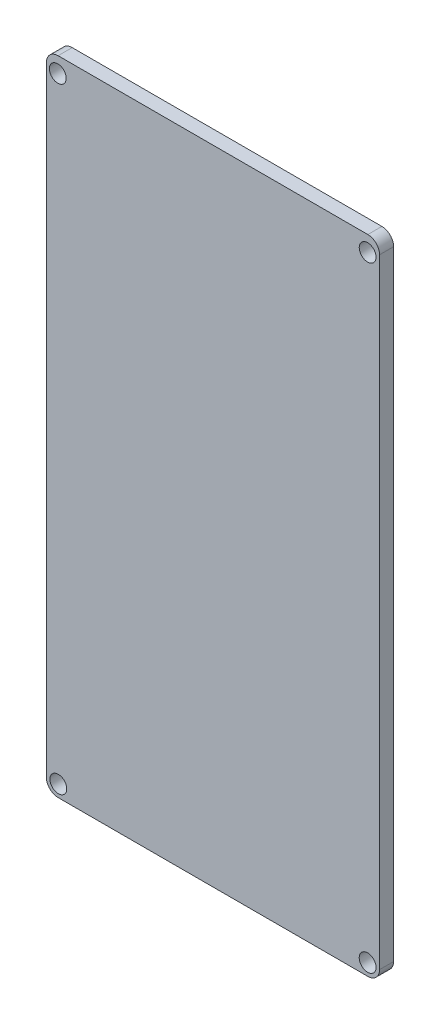
ISO-10303-21;
HEADER;
FILE_DESCRIPTION(('STEP AP214'),'2;1');
FILE_NAME('part.step','',(''),(''),'','','');
FILE_SCHEMA(('AUTOMOTIVE_DESIGN { 1 0 10303 214 1 1 1 1 }'));
ENDSEC;
DATA;
#1=APPLICATION_CONTEXT('core data for automotive mechanical design processes');
#2=APPLICATION_PROTOCOL_DEFINITION('international standard','automotive_design',2000,#1);
#3=PRODUCT_CONTEXT('',#1,'mechanical');
#4=PRODUCT('Part','Part','',(#3));
#5=PRODUCT_RELATED_PRODUCT_CATEGORY('part','',(#4));
#6=PRODUCT_DEFINITION_FORMATION('','',#4);
#7=PRODUCT_DEFINITION_CONTEXT('part definition',#1,'design');
#8=PRODUCT_DEFINITION('design','',#6,#7);
#9=PRODUCT_DEFINITION_SHAPE('','',#8);
#10=(LENGTH_UNIT() NAMED_UNIT(*) SI_UNIT(.MILLI.,.METRE.));
#11=(NAMED_UNIT(*) PLANE_ANGLE_UNIT() SI_UNIT($,.RADIAN.));
#12=(NAMED_UNIT(*) SI_UNIT($,.STERADIAN.) SOLID_ANGLE_UNIT());
#13=UNCERTAINTY_MEASURE_WITH_UNIT(LENGTH_MEASURE(1.E-05),#10,'distance_accuracy_value','');
#14=(GEOMETRIC_REPRESENTATION_CONTEXT(3) GLOBAL_UNCERTAINTY_ASSIGNED_CONTEXT((#13)) GLOBAL_UNIT_ASSIGNED_CONTEXT((#10,
#11,#12)) REPRESENTATION_CONTEXT('',''));
#15=CARTESIAN_POINT('',(0.,0.,0.));
#16=DIRECTION('',(0.,0.,1.));
#17=DIRECTION('',(1.,0.,0.));
#18=AXIS2_PLACEMENT_3D('',#15,#16,#17);
#19=CARTESIAN_POINT('',(128.945,-223.883779,-3.));
#20=DIRECTION('',(0.,0.,1.));
#21=DIRECTION('',(1.,0.,0.));
#22=AXIS2_PLACEMENT_3D('',#19,#20,#21);
#23=CYLINDRICAL_SURFACE('',#22,2.5);
#24=CARTESIAN_POINT('',(128.945,-223.883779,0.));
#25=DIRECTION('',(0.,0.,1.));
#26=DIRECTION('',(1.,0.,0.));
#27=AXIS2_PLACEMENT_3D('',#24,#25,#26);
#28=CIRCLE('',#27,2.5);
#29=CARTESIAN_POINT('',(128.945,-226.383779,0.));
#30=VERTEX_POINT('',#29);
#31=CARTESIAN_POINT('',(131.445,-223.883779,0.));
#32=VERTEX_POINT('',#31);
#33=EDGE_CURVE('E129',#30,#32,#28,.T.);
#34=ORIENTED_EDGE('',*,*,#33,.F.);
#35=DIRECTION('',(0.,0.,1.));
#36=VECTOR('',#35,1.);
#37=CARTESIAN_POINT('',(128.945,-226.383779,-3.));
#38=LINE('',#37,#36);
#39=CARTESIAN_POINT('',(128.945,-226.383779,-3.));
#40=VERTEX_POINT('',#39);
#41=EDGE_CURVE('E11',#40,#30,#38,.T.);
#42=ORIENTED_EDGE('',*,*,#41,.F.);
#43=CARTESIAN_POINT('',(128.945,-223.883779,-3.));
#44=DIRECTION('',(0.,0.,1.));
#45=DIRECTION('',(1.,0.,0.));
#46=AXIS2_PLACEMENT_3D('',#43,#44,#45);
#47=CIRCLE('',#46,2.5);
#48=CARTESIAN_POINT('',(131.445,-223.883779,-3.));
#49=VERTEX_POINT('',#48);
#50=EDGE_CURVE('E150',#40,#49,#47,.T.);
#51=ORIENTED_EDGE('',*,*,#50,.T.);
#52=DIRECTION('',(0.,0.,1.));
#53=VECTOR('',#52,1.);
#54=CARTESIAN_POINT('',(131.445,-223.883779,-3.));
#55=LINE('',#54,#53);
#56=EDGE_CURVE('E35',#49,#32,#55,.T.);
#57=ORIENTED_EDGE('',*,*,#56,.T.);
#58=EDGE_LOOP('',(#34,#42,#51,#57));
#59=FACE_BOUND('',#58,.T.);
#60=ADVANCED_FACE('F32',(#59),#23,.T.);
#61=CARTESIAN_POINT('',(62.825,-226.383779,-3.));
#62=DIRECTION('',(0.,-1.,0.));
#63=DIRECTION('',(0.,0.,-1.));
#64=AXIS2_PLACEMENT_3D('',#61,#62,#63);
#65=PLANE('',#64);
#66=DIRECTION('',(1.,0.,0.));
#67=VECTOR('',#66,1.);
#68=CARTESIAN_POINT('',(62.825,-226.383779,0.));
#69=LINE('',#68,#67);
#70=CARTESIAN_POINT('',(62.825,-226.383779,0.));
#71=VERTEX_POINT('',#70);
#72=EDGE_CURVE('E148',#71,#30,#69,.T.);
#73=ORIENTED_EDGE('',*,*,#72,.F.);
#74=DIRECTION('',(0.,0.,1.));
#75=VECTOR('',#74,1.);
#76=CARTESIAN_POINT('',(62.825,-226.383779,-3.));
#77=LINE('',#76,#75);
#78=CARTESIAN_POINT('',(62.825,-226.383779,-3.));
#79=VERTEX_POINT('',#78);
#80=EDGE_CURVE('E41',#79,#71,#77,.T.);
#81=ORIENTED_EDGE('',*,*,#80,.F.);
#82=DIRECTION('',(1.,0.,0.));
#83=VECTOR('',#82,1.);
#84=CARTESIAN_POINT('',(62.825,-226.383779,-3.));
#85=LINE('',#84,#83);
#86=EDGE_CURVE('E119',#79,#40,#85,.T.);
#87=ORIENTED_EDGE('',*,*,#86,.T.);
#88=ORIENTED_EDGE('',*,*,#41,.T.);
#89=EDGE_LOOP('',(#73,#81,#87,#88));
#90=FACE_BOUND('',#89,.T.);
#91=ADVANCED_FACE('F162',(#90),#65,.T.);
#92=CARTESIAN_POINT('',(62.825,-223.883779,-3.));
#93=DIRECTION('',(0.,0.,1.));
#94=DIRECTION('',(1.,0.,0.));
#95=AXIS2_PLACEMENT_3D('',#92,#93,#94);
#96=CYLINDRICAL_SURFACE('',#95,2.5);
#97=CARTESIAN_POINT('',(62.825,-223.883779,0.));
#98=DIRECTION('',(0.,0.,1.));
#99=DIRECTION('',(-1.,0.,0.));
#100=AXIS2_PLACEMENT_3D('',#97,#98,#99);
#101=CIRCLE('',#100,2.5);
#102=CARTESIAN_POINT('',(60.325,-223.883779,0.));
#103=VERTEX_POINT('',#102);
#104=EDGE_CURVE('E106',#103,#71,#101,.T.);
#105=ORIENTED_EDGE('',*,*,#104,.F.);
#106=DIRECTION('',(0.,0.,1.));
#107=VECTOR('',#106,1.);
#108=CARTESIAN_POINT('',(60.325,-223.883779,-3.));
#109=LINE('',#108,#107);
#110=CARTESIAN_POINT('',(60.325,-223.883779,-3.));
#111=VERTEX_POINT('',#110);
#112=EDGE_CURVE('E101',#111,#103,#109,.T.);
#113=ORIENTED_EDGE('',*,*,#112,.F.);
#114=CARTESIAN_POINT('',(62.825,-223.883779,-3.));
#115=DIRECTION('',(0.,0.,1.));
#116=DIRECTION('',(-1.,0.,0.));
#117=AXIS2_PLACEMENT_3D('',#114,#115,#116);
#118=CIRCLE('',#117,2.5);
#119=EDGE_CURVE('E104',#111,#79,#118,.T.);
#120=ORIENTED_EDGE('',*,*,#119,.T.);
#121=ORIENTED_EDGE('',*,*,#80,.T.);
#122=EDGE_LOOP('',(#105,#113,#120,#121));
#123=FACE_BOUND('',#122,.T.);
#124=ADVANCED_FACE('F103',(#123),#96,.T.);
#125=CARTESIAN_POINT('',(60.325,-223.883779,-3.));
#126=DIRECTION('',(-1.,0.,0.));
#127=DIRECTION('',(0.,0.,1.));
#128=AXIS2_PLACEMENT_3D('',#125,#126,#127);
#129=PLANE('',#128);
#130=DIRECTION('',(0.,-1.,0.));
#131=VECTOR('',#130,1.);
#132=CARTESIAN_POINT('',(60.325,-223.883779,0.));
#133=LINE('',#132,#131);
#134=CARTESIAN_POINT('',(60.325,-91.723779,0.));
#135=VERTEX_POINT('',#134);
#136=EDGE_CURVE('E145',#135,#103,#133,.T.);
#137=ORIENTED_EDGE('',*,*,#136,.F.);
#138=DIRECTION('',(0.,0.,1.));
#139=VECTOR('',#138,1.);
#140=CARTESIAN_POINT('',(60.325,-91.723779,-3.));
#141=LINE('',#140,#139);
#142=CARTESIAN_POINT('',(60.325,-91.723779,-3.));
#143=VERTEX_POINT('',#142);
#144=EDGE_CURVE('E111',#143,#135,#141,.T.);
#145=ORIENTED_EDGE('',*,*,#144,.F.);
#146=DIRECTION('',(0.,-1.,0.));
#147=VECTOR('',#146,1.);
#148=CARTESIAN_POINT('',(60.325,-223.883779,-3.));
#149=LINE('',#148,#147);
#150=EDGE_CURVE('E117',#143,#111,#149,.T.);
#151=ORIENTED_EDGE('',*,*,#150,.T.);
#152=ORIENTED_EDGE('',*,*,#112,.T.);
#153=EDGE_LOOP('',(#137,#145,#151,#152));
#154=FACE_BOUND('',#153,.T.);
#155=ADVANCED_FACE('F121',(#154),#129,.T.);
#156=CARTESIAN_POINT('',(62.825,-91.723779,-3.));
#157=DIRECTION('',(0.,0.,1.));
#158=DIRECTION('',(1.,0.,0.));
#159=AXIS2_PLACEMENT_3D('',#156,#157,#158);
#160=CYLINDRICAL_SURFACE('',#159,2.5);
#161=CARTESIAN_POINT('',(62.825,-91.723779,0.));
#162=DIRECTION('',(0.,0.,1.));
#163=DIRECTION('',(-1.,0.,0.));
#164=AXIS2_PLACEMENT_3D('',#161,#162,#163);
#165=CIRCLE('',#164,2.5);
#166=CARTESIAN_POINT('',(62.825,-89.223779,0.));
#167=VERTEX_POINT('',#166);
#168=EDGE_CURVE('E142',#167,#135,#165,.T.);
#169=ORIENTED_EDGE('',*,*,#168,.F.);
#170=DIRECTION('',(0.,0.,1.));
#171=VECTOR('',#170,1.);
#172=CARTESIAN_POINT('',(62.825,-89.223779,-3.));
#173=LINE('',#172,#171);
#174=CARTESIAN_POINT('',(62.825,-89.223779,-3.));
#175=VERTEX_POINT('',#174);
#176=EDGE_CURVE('E154',#175,#167,#173,.T.);
#177=ORIENTED_EDGE('',*,*,#176,.F.);
#178=CARTESIAN_POINT('',(62.825,-91.723779,-3.));
#179=DIRECTION('',(0.,0.,1.));
#180=DIRECTION('',(-1.,0.,0.));
#181=AXIS2_PLACEMENT_3D('',#178,#179,#180);
#182=CIRCLE('',#181,2.5);
#183=EDGE_CURVE('E122',#175,#143,#182,.T.);
#184=ORIENTED_EDGE('',*,*,#183,.T.);
#185=ORIENTED_EDGE('',*,*,#144,.T.);
#186=EDGE_LOOP('',(#169,#177,#184,#185));
#187=FACE_BOUND('',#186,.T.);
#188=ADVANCED_FACE('F175',(#187),#160,.T.);
#189=CARTESIAN_POINT('',(62.825,-89.223779,-3.));
#190=DIRECTION('',(0.,1.,0.));
#191=DIRECTION('',(0.,0.,1.));
#192=AXIS2_PLACEMENT_3D('',#189,#190,#191);
#193=PLANE('',#192);
#194=DIRECTION('',(-1.,0.,0.));
#195=VECTOR('',#194,1.);
#196=CARTESIAN_POINT('',(62.825,-89.223779,0.));
#197=LINE('',#196,#195);
#198=CARTESIAN_POINT('',(128.945,-89.223779,0.));
#199=VERTEX_POINT('',#198);
#200=EDGE_CURVE('E139',#199,#167,#197,.T.);
#201=ORIENTED_EDGE('',*,*,#200,.F.);
#202=DIRECTION('',(0.,0.,1.));
#203=VECTOR('',#202,1.);
#204=CARTESIAN_POINT('',(128.945,-89.223779,-3.));
#205=LINE('',#204,#203);
#206=CARTESIAN_POINT('',(128.945,-89.223779,-3.));
#207=VERTEX_POINT('',#206);
#208=EDGE_CURVE('E156',#207,#199,#205,.T.);
#209=ORIENTED_EDGE('',*,*,#208,.F.);
#210=DIRECTION('',(-1.,0.,0.));
#211=VECTOR('',#210,1.);
#212=CARTESIAN_POINT('',(62.825,-89.223779,-3.));
#213=LINE('',#212,#211);
#214=EDGE_CURVE('E124',#207,#175,#213,.T.);
#215=ORIENTED_EDGE('',*,*,#214,.T.);
#216=ORIENTED_EDGE('',*,*,#176,.T.);
#217=EDGE_LOOP('',(#201,#209,#215,#216));
#218=FACE_BOUND('',#217,.T.);
#219=ADVANCED_FACE('F178',(#218),#193,.T.);
#220=CARTESIAN_POINT('',(128.945,-91.723779,-3.));
#221=DIRECTION('',(0.,0.,1.));
#222=DIRECTION('',(1.,0.,0.));
#223=AXIS2_PLACEMENT_3D('',#220,#221,#222);
#224=CYLINDRICAL_SURFACE('',#223,2.5);
#225=CARTESIAN_POINT('',(128.945,-91.723779,0.));
#226=DIRECTION('',(0.,0.,1.));
#227=DIRECTION('',(-1.,0.,0.));
#228=AXIS2_PLACEMENT_3D('',#225,#226,#227);
#229=CIRCLE('',#228,2.5);
#230=CARTESIAN_POINT('',(131.445,-91.723779,0.));
#231=VERTEX_POINT('',#230);
#232=EDGE_CURVE('E136',#231,#199,#229,.T.);
#233=ORIENTED_EDGE('',*,*,#232,.F.);
#234=DIRECTION('',(0.,0.,1.));
#235=VECTOR('',#234,1.);
#236=CARTESIAN_POINT('',(131.445,-91.723779,-3.));
#237=LINE('',#236,#235);
#238=CARTESIAN_POINT('',(131.445,-91.723779,-3.));
#239=VERTEX_POINT('',#238);
#240=EDGE_CURVE('E157',#239,#231,#237,.T.);
#241=ORIENTED_EDGE('',*,*,#240,.F.);
#242=CARTESIAN_POINT('',(128.945,-91.723779,-3.));
#243=DIRECTION('',(0.,0.,1.));
#244=DIRECTION('',(-1.,0.,0.));
#245=AXIS2_PLACEMENT_3D('',#242,#243,#244);
#246=CIRCLE('',#245,2.5);
#247=EDGE_CURVE('E244',#239,#207,#246,.T.);
#248=ORIENTED_EDGE('',*,*,#247,.T.);
#249=ORIENTED_EDGE('',*,*,#208,.T.);
#250=EDGE_LOOP('',(#233,#241,#248,#249));
#251=FACE_BOUND('',#250,.T.);
#252=ADVANCED_FACE('F182',(#251),#224,.T.);
#253=CARTESIAN_POINT('',(131.445,-223.883779,-3.));
#254=DIRECTION('',(1.,0.,0.));
#255=DIRECTION('',(0.,0.,-1.));
#256=AXIS2_PLACEMENT_3D('',#253,#254,#255);
#257=PLANE('',#256);
#258=DIRECTION('',(0.,1.,0.));
#259=VECTOR('',#258,1.);
#260=CARTESIAN_POINT('',(131.445,-223.883779,0.));
#261=LINE('',#260,#259);
#262=EDGE_CURVE('E132',#32,#231,#261,.T.);
#263=ORIENTED_EDGE('',*,*,#262,.F.);
#264=ORIENTED_EDGE('',*,*,#56,.F.);
#265=DIRECTION('',(0.,1.,0.));
#266=VECTOR('',#265,1.);
#267=CARTESIAN_POINT('',(131.445,-223.883779,-3.));
#268=LINE('',#267,#266);
#269=EDGE_CURVE('E242',#49,#239,#268,.T.);
#270=ORIENTED_EDGE('',*,*,#269,.T.);
#271=ORIENTED_EDGE('',*,*,#240,.T.);
#272=EDGE_LOOP('',(#263,#264,#270,#271));
#273=FACE_BOUND('',#272,.T.);
#274=ADVANCED_FACE('F159',(#273),#257,.T.);
#275=CARTESIAN_POINT('',(128.945,-223.883779,-3.));
#276=DIRECTION('',(0.,0.,1.));
#277=DIRECTION('',(1.,0.,0.));
#278=AXIS2_PLACEMENT_3D('',#275,#276,#277);
#279=PLANE('',#278);
#280=CARTESIAN_POINT('',(128.905000137281,-92.543812420741,-3.));
#281=DIRECTION('',(0.,0.,1.));
#282=DIRECTION('',(1.,0.,0.));
#283=AXIS2_PLACEMENT_3D('',#280,#281,#282);
#284=CIRCLE('',#283,1.7960518627195);
#285=CARTESIAN_POINT('',(130.701052,-92.543812420741,-3.));
#286=VERTEX_POINT('',#285);
#287=EDGE_CURVE('E217',#286,#286,#284,.T.);
#288=ORIENTED_EDGE('',*,*,#287,.T.);
#289=EDGE_LOOP('',(#288));
#290=FACE_BOUND('',#289,.T.);
#291=CARTESIAN_POINT('',(62.756034,-92.5438125,-3.));
#292=DIRECTION('',(0.,0.,1.));
#293=DIRECTION('',(1.,0.,0.));
#294=AXIS2_PLACEMENT_3D('',#291,#292,#293);
#295=CIRCLE('',#294,1.79605186271951);
#296=CARTESIAN_POINT('',(64.5520858627195,-92.5438125,-3.));
#297=VERTEX_POINT('',#296);
#298=EDGE_CURVE('E225',#297,#297,#295,.T.);
#299=ORIENTED_EDGE('',*,*,#298,.T.);
#300=EDGE_LOOP('',(#299));
#301=FACE_BOUND('',#300,.T.);
#302=CARTESIAN_POINT('',(62.87282721695,-223.848297546274,-3.));
#303=DIRECTION('',(0.,0.,1.));
#304=DIRECTION('',(1.,0.,0.));
#305=AXIS2_PLACEMENT_3D('',#302,#303,#304);
#306=CIRCLE('',#305,1.79607460331765);
#307=CARTESIAN_POINT('',(64.6689018202676,-223.848297546274,-3.));
#308=VERTEX_POINT('',#307);
#309=EDGE_CURVE('E231',#308,#308,#306,.T.);
#310=ORIENTED_EDGE('',*,*,#309,.T.);
#311=EDGE_LOOP('',(#310));
#312=FACE_BOUND('',#311,.T.);
#313=CARTESIAN_POINT('',(128.905,-223.8437785,-3.));
#314=DIRECTION('',(0.,0.,1.));
#315=DIRECTION('',(1.,0.,0.));
#316=AXIS2_PLACEMENT_3D('',#313,#314,#315);
#317=CIRCLE('',#316,1.7960518627195);
#318=CARTESIAN_POINT('',(130.701051862719,-223.8437785,-3.));
#319=VERTEX_POINT('',#318);
#320=EDGE_CURVE('E133',#319,#319,#317,.T.);
#321=ORIENTED_EDGE('',*,*,#320,.T.);
#322=EDGE_LOOP('',(#321));
#323=FACE_BOUND('',#322,.T.);
#324=ORIENTED_EDGE('',*,*,#50,.F.);
#325=ORIENTED_EDGE('',*,*,#86,.F.);
#326=ORIENTED_EDGE('',*,*,#119,.F.);
#327=ORIENTED_EDGE('',*,*,#150,.F.);
#328=ORIENTED_EDGE('',*,*,#183,.F.);
#329=ORIENTED_EDGE('',*,*,#214,.F.);
#330=ORIENTED_EDGE('',*,*,#247,.F.);
#331=ORIENTED_EDGE('',*,*,#269,.F.);
#332=EDGE_LOOP('',(#324,#325,#326,#327,#328,#329,#330,#331));
#333=FACE_BOUND('',#332,.T.);
#334=ADVANCED_FACE('F115',(#290,#301,#312,#323,#333),#279,.F.);
#335=CARTESIAN_POINT('',(128.945,-223.883779,0.));
#336=DIRECTION('',(0.,0.,1.));
#337=DIRECTION('',(1.,0.,0.));
#338=AXIS2_PLACEMENT_3D('',#335,#336,#337);
#339=PLANE('',#338);
#340=CARTESIAN_POINT('',(128.905000137281,-92.543812420741,0.));
#341=DIRECTION('',(0.,0.,1.));
#342=DIRECTION('',(1.,0.,0.));
#343=AXIS2_PLACEMENT_3D('',#340,#341,#342);
#344=CIRCLE('',#343,1.7960518627195);
#345=CARTESIAN_POINT('',(130.701052,-92.543812420741,0.));
#346=VERTEX_POINT('',#345);
#347=EDGE_CURVE('E220',#346,#346,#344,.T.);
#348=ORIENTED_EDGE('',*,*,#347,.F.);
#349=EDGE_LOOP('',(#348));
#350=FACE_BOUND('',#349,.T.);
#351=CARTESIAN_POINT('',(62.756034,-92.5438125,0.));
#352=DIRECTION('',(0.,0.,1.));
#353=DIRECTION('',(1.,0.,0.));
#354=AXIS2_PLACEMENT_3D('',#351,#352,#353);
#355=CIRCLE('',#354,1.79605186271951);
#356=CARTESIAN_POINT('',(64.5520858627195,-92.5438125,0.));
#357=VERTEX_POINT('',#356);
#358=EDGE_CURVE('E222',#357,#357,#355,.T.);
#359=ORIENTED_EDGE('',*,*,#358,.F.);
#360=EDGE_LOOP('',(#359));
#361=FACE_BOUND('',#360,.T.);
#362=CARTESIAN_POINT('',(62.87282721695,-223.848297546274,0.));
#363=DIRECTION('',(0.,0.,1.));
#364=DIRECTION('',(1.,0.,0.));
#365=AXIS2_PLACEMENT_3D('',#362,#363,#364);
#366=CIRCLE('',#365,1.79607460331765);
#367=CARTESIAN_POINT('',(64.6689018202676,-223.848297546274,0.));
#368=VERTEX_POINT('',#367);
#369=EDGE_CURVE('E228',#368,#368,#366,.T.);
#370=ORIENTED_EDGE('',*,*,#369,.F.);
#371=EDGE_LOOP('',(#370));
#372=FACE_BOUND('',#371,.T.);
#373=CARTESIAN_POINT('',(128.905,-223.8437785,0.));
#374=DIRECTION('',(0.,0.,1.));
#375=DIRECTION('',(1.,0.,0.));
#376=AXIS2_PLACEMENT_3D('',#373,#374,#375);
#377=CIRCLE('',#376,1.7960518627195);
#378=CARTESIAN_POINT('',(130.701051862719,-223.8437785,0.));
#379=VERTEX_POINT('',#378);
#380=EDGE_CURVE('E234',#379,#379,#377,.T.);
#381=ORIENTED_EDGE('',*,*,#380,.F.);
#382=EDGE_LOOP('',(#381));
#383=FACE_BOUND('',#382,.T.);
#384=ORIENTED_EDGE('',*,*,#33,.T.);
#385=ORIENTED_EDGE('',*,*,#262,.T.);
#386=ORIENTED_EDGE('',*,*,#232,.T.);
#387=ORIENTED_EDGE('',*,*,#200,.T.);
#388=ORIENTED_EDGE('',*,*,#168,.T.);
#389=ORIENTED_EDGE('',*,*,#136,.T.);
#390=ORIENTED_EDGE('',*,*,#104,.T.);
#391=ORIENTED_EDGE('',*,*,#72,.T.);
#392=EDGE_LOOP('',(#384,#385,#386,#387,#388,#389,#390,#391));
#393=FACE_BOUND('',#392,.T.);
#394=ADVANCED_FACE('F161',(#350,#361,#372,#383,#393),#339,.T.);
#395=CARTESIAN_POINT('',(128.905,-223.8437785,-3.));
#396=DIRECTION('',(0.,0.,1.));
#397=DIRECTION('',(1.,0.,0.));
#398=AXIS2_PLACEMENT_3D('',#395,#396,#397);
#399=CYLINDRICAL_SURFACE('',#398,1.7960518627195);
#400=ORIENTED_EDGE('',*,*,#320,.F.);
#401=EDGE_LOOP('',(#400));
#402=FACE_BOUND('',#401,.T.);
#403=ORIENTED_EDGE('',*,*,#380,.T.);
#404=EDGE_LOOP('',(#403));
#405=FACE_BOUND('',#404,.T.);
#406=ADVANCED_FACE('F194',(#402,#405),#399,.F.);
#407=CARTESIAN_POINT('',(62.87282721695,-223.848297546274,-3.));
#408=DIRECTION('',(0.,0.,1.));
#409=DIRECTION('',(1.,0.,0.));
#410=AXIS2_PLACEMENT_3D('',#407,#408,#409);
#411=CYLINDRICAL_SURFACE('',#410,1.79607460331765);
#412=ORIENTED_EDGE('',*,*,#309,.F.);
#413=EDGE_LOOP('',(#412));
#414=FACE_BOUND('',#413,.T.);
#415=ORIENTED_EDGE('',*,*,#369,.T.);
#416=EDGE_LOOP('',(#415));
#417=FACE_BOUND('',#416,.T.);
#418=ADVANCED_FACE('F201',(#414,#417),#411,.F.);
#419=CARTESIAN_POINT('',(62.756034,-92.5438125,-3.));
#420=DIRECTION('',(0.,0.,1.));
#421=DIRECTION('',(1.,0.,0.));
#422=AXIS2_PLACEMENT_3D('',#419,#420,#421);
#423=CYLINDRICAL_SURFACE('',#422,1.79605186271951);
#424=ORIENTED_EDGE('',*,*,#298,.F.);
#425=EDGE_LOOP('',(#424));
#426=FACE_BOUND('',#425,.T.);
#427=ORIENTED_EDGE('',*,*,#358,.T.);
#428=EDGE_LOOP('',(#427));
#429=FACE_BOUND('',#428,.T.);
#430=ADVANCED_FACE('F205',(#426,#429),#423,.F.);
#431=CARTESIAN_POINT('',(128.905000137281,-92.543812420741,-3.));
#432=DIRECTION('',(0.,0.,1.));
#433=DIRECTION('',(1.,0.,0.));
#434=AXIS2_PLACEMENT_3D('',#431,#432,#433);
#435=CYLINDRICAL_SURFACE('',#434,1.7960518627195);
#436=ORIENTED_EDGE('',*,*,#287,.F.);
#437=EDGE_LOOP('',(#436));
#438=FACE_BOUND('',#437,.T.);
#439=ORIENTED_EDGE('',*,*,#347,.T.);
#440=EDGE_LOOP('',(#439));
#441=FACE_BOUND('',#440,.T.);
#442=ADVANCED_FACE('F209',(#438,#441),#435,.F.);
#443=CLOSED_SHELL('',(#60,#91,#124,#155,#188,#219,#252,#274,#334,#394,#406,#418,#430,#442));
#444=MANIFOLD_SOLID_BREP('B2',#443);
#445=ADVANCED_BREP_SHAPE_REPRESENTATION('',(#18,#444),#14);
#446=SHAPE_DEFINITION_REPRESENTATION(#9,#445);
ENDSEC;
END-ISO-10303-21;
